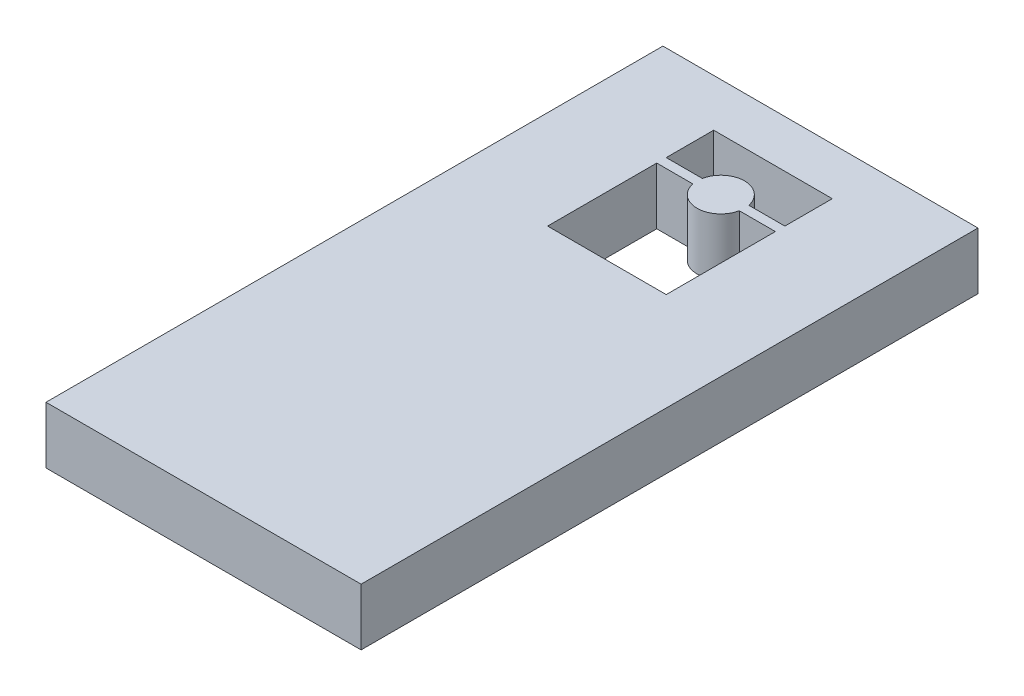
ISO-10303-21;
HEADER;
FILE_DESCRIPTION(('STEP AP214'),'2;1');
FILE_NAME('part.step','',(''),(''),'','','');
FILE_SCHEMA(('AUTOMOTIVE_DESIGN { 1 0 10303 214 1 1 1 1 }'));
ENDSEC;
DATA;
#1=APPLICATION_CONTEXT('core data for automotive mechanical design processes');
#2=APPLICATION_PROTOCOL_DEFINITION('international standard','automotive_design',2000,#1);
#3=PRODUCT_CONTEXT('',#1,'mechanical');
#4=PRODUCT('Part','Part','',(#3));
#5=PRODUCT_RELATED_PRODUCT_CATEGORY('part','',(#4));
#6=PRODUCT_DEFINITION_FORMATION('','',#4);
#7=PRODUCT_DEFINITION_CONTEXT('part definition',#1,'design');
#8=PRODUCT_DEFINITION('design','',#6,#7);
#9=PRODUCT_DEFINITION_SHAPE('','',#8);
#10=(LENGTH_UNIT() NAMED_UNIT(*) SI_UNIT(.MILLI.,.METRE.));
#11=(NAMED_UNIT(*) PLANE_ANGLE_UNIT() SI_UNIT($,.RADIAN.));
#12=(NAMED_UNIT(*) SI_UNIT($,.STERADIAN.) SOLID_ANGLE_UNIT());
#13=UNCERTAINTY_MEASURE_WITH_UNIT(LENGTH_MEASURE(1.E-05),#10,'distance_accuracy_value','');
#14=(GEOMETRIC_REPRESENTATION_CONTEXT(3) GLOBAL_UNCERTAINTY_ASSIGNED_CONTEXT((#13)) GLOBAL_UNIT_ASSIGNED_CONTEXT((#10,
#11,#12)) REPRESENTATION_CONTEXT('',''));
#15=CARTESIAN_POINT('',(0.,0.,0.));
#16=DIRECTION('',(0.,0.,1.));
#17=DIRECTION('',(1.,0.,0.));
#18=AXIS2_PLACEMENT_3D('',#15,#16,#17);
#19=CARTESIAN_POINT('',(20.7,0.,-110.));
#20=DIRECTION('',(0.,0.,-1.));
#21=DIRECTION('',(-1.,0.,0.));
#22=AXIS2_PLACEMENT_3D('',#19,#20,#21);
#23=PLANE('',#22);
#24=DIRECTION('',(0.,1.,0.));
#25=VECTOR('',#24,1.);
#26=CARTESIAN_POINT('',(28.3010205144337,0.,-110.));
#27=LINE('',#26,#25);
#28=CARTESIAN_POINT('',(28.3010205144337,0.,-110.));
#29=VERTEX_POINT('',#28);
#30=CARTESIAN_POINT('',(28.3010205144337,12.,-110.));
#31=VERTEX_POINT('',#30);
#32=EDGE_CURVE('E152',#29,#31,#27,.T.);
#33=ORIENTED_EDGE('',*,*,#32,.F.);
#34=DIRECTION('',(-1.,0.,0.));
#35=VECTOR('',#34,1.);
#36=CARTESIAN_POINT('',(20.7,0.,-110.));
#37=LINE('',#36,#35);
#38=CARTESIAN_POINT('',(20.7,0.,-110.));
#39=VERTEX_POINT('',#38);
#40=EDGE_CURVE('E272',#29,#39,#37,.T.);
#41=ORIENTED_EDGE('',*,*,#40,.T.);
#42=DIRECTION('',(0.,1.,0.));
#43=VECTOR('',#42,1.);
#44=CARTESIAN_POINT('',(20.7,0.,-110.));
#45=LINE('',#44,#43);
#46=CARTESIAN_POINT('',(20.7,12.,-110.));
#47=VERTEX_POINT('',#46);
#48=EDGE_CURVE('E180',#39,#47,#45,.T.);
#49=ORIENTED_EDGE('',*,*,#48,.T.);
#50=DIRECTION('',(-1.,0.,0.));
#51=VECTOR('',#50,1.);
#52=CARTESIAN_POINT('',(20.7,12.,-110.));
#53=LINE('',#52,#51);
#54=EDGE_CURVE('E172',#31,#47,#53,.T.);
#55=ORIENTED_EDGE('',*,*,#54,.F.);
#56=EDGE_LOOP('',(#33,#41,#49,#55));
#57=FACE_BOUND('',#56,.T.);
#58=ADVANCED_FACE('F37',(#57),#23,.T.);
#59=CARTESIAN_POINT('',(20.7,0.,-108.));
#60=DIRECTION('',(0.,0.,1.));
#61=DIRECTION('',(1.,0.,0.));
#62=AXIS2_PLACEMENT_3D('',#59,#60,#61);
#63=PLANE('',#62);
#64=DIRECTION('',(0.,1.,0.));
#65=VECTOR('',#64,1.);
#66=CARTESIAN_POINT('',(38.0989794855664,0.,-108.));
#67=LINE('',#66,#65);
#68=CARTESIAN_POINT('',(38.0989794855664,0.,-108.));
#69=VERTEX_POINT('',#68);
#70=CARTESIAN_POINT('',(38.0989794855664,12.,-108.));
#71=VERTEX_POINT('',#70);
#72=EDGE_CURVE('E11',#69,#71,#67,.T.);
#73=ORIENTED_EDGE('',*,*,#72,.F.);
#74=DIRECTION('',(1.,0.,0.));
#75=VECTOR('',#74,1.);
#76=CARTESIAN_POINT('',(20.7,0.,-108.));
#77=LINE('',#76,#75);
#78=CARTESIAN_POINT('',(45.7,0.,-108.));
#79=VERTEX_POINT('',#78);
#80=EDGE_CURVE('E171',#69,#79,#77,.T.);
#81=ORIENTED_EDGE('',*,*,#80,.T.);
#82=DIRECTION('',(0.,1.,0.));
#83=VECTOR('',#82,1.);
#84=CARTESIAN_POINT('',(45.7,0.,-108.));
#85=LINE('',#84,#83);
#86=CARTESIAN_POINT('',(45.7,12.,-108.));
#87=VERTEX_POINT('',#86);
#88=EDGE_CURVE('E186',#79,#87,#85,.T.);
#89=ORIENTED_EDGE('',*,*,#88,.T.);
#90=DIRECTION('',(1.,0.,0.));
#91=VECTOR('',#90,1.);
#92=CARTESIAN_POINT('',(20.7,12.,-108.));
#93=LINE('',#92,#91);
#94=EDGE_CURVE('E274',#71,#87,#93,.T.);
#95=ORIENTED_EDGE('',*,*,#94,.F.);
#96=EDGE_LOOP('',(#73,#81,#89,#95));
#97=FACE_BOUND('',#96,.T.);
#98=ADVANCED_FACE('F289',(#97),#63,.T.);
#99=CARTESIAN_POINT('',(20.7,-8.,-130.));
#100=DIRECTION('',(-1.,0.,0.));
#101=DIRECTION('',(0.,0.,1.));
#102=AXIS2_PLACEMENT_3D('',#99,#100,#101);
#103=PLANE('',#102);
#104=DIRECTION('',(0.,0.,1.));
#105=VECTOR('',#104,1.);
#106=CARTESIAN_POINT('',(20.7,12.,-130.));
#107=LINE('',#106,#105);
#108=CARTESIAN_POINT('',(20.7,12.,-120.));
#109=VERTEX_POINT('',#108);
#110=EDGE_CURVE('E203',#109,#47,#107,.T.);
#111=ORIENTED_EDGE('',*,*,#110,.T.);
#112=ORIENTED_EDGE('',*,*,#48,.F.);
#113=DIRECTION('',(0.,0.,-1.));
#114=VECTOR('',#113,1.);
#115=CARTESIAN_POINT('',(20.7,0.,0.));
#116=LINE('',#115,#114);
#117=CARTESIAN_POINT('',(20.7,0.,-120.));
#118=VERTEX_POINT('',#117);
#119=EDGE_CURVE('E252',#39,#118,#116,.T.);
#120=ORIENTED_EDGE('',*,*,#119,.T.);
#121=DIRECTION('',(0.,1.,0.));
#122=VECTOR('',#121,1.);
#123=CARTESIAN_POINT('',(20.7,0.,-120.));
#124=LINE('',#123,#122);
#125=EDGE_CURVE('E195',#118,#109,#124,.T.);
#126=ORIENTED_EDGE('',*,*,#125,.T.);
#127=EDGE_LOOP('',(#111,#112,#120,#126));
#128=FACE_BOUND('',#127,.T.);
#129=ADVANCED_FACE('F291',(#128),#103,.F.);
#130=CARTESIAN_POINT('',(45.7,-8.,-130.));
#131=DIRECTION('',(1.,0.,0.));
#132=DIRECTION('',(0.,0.,-1.));
#133=AXIS2_PLACEMENT_3D('',#130,#131,#132);
#134=PLANE('',#133);
#135=DIRECTION('',(0.,0.,1.));
#136=VECTOR('',#135,1.);
#137=CARTESIAN_POINT('',(45.7,0.,0.));
#138=LINE('',#137,#136);
#139=CARTESIAN_POINT('',(45.7,0.,-120.));
#140=VERTEX_POINT('',#139);
#141=CARTESIAN_POINT('',(45.7,0.,-110.));
#142=VERTEX_POINT('',#141);
#143=EDGE_CURVE('E250',#140,#142,#138,.T.);
#144=ORIENTED_EDGE('',*,*,#143,.T.);
#145=DIRECTION('',(0.,1.,0.));
#146=VECTOR('',#145,1.);
#147=CARTESIAN_POINT('',(45.7,0.,-110.));
#148=LINE('',#147,#146);
#149=CARTESIAN_POINT('',(45.7,12.,-110.));
#150=VERTEX_POINT('',#149);
#151=EDGE_CURVE('E184',#142,#150,#148,.T.);
#152=ORIENTED_EDGE('',*,*,#151,.T.);
#153=DIRECTION('',(0.,0.,-1.));
#154=VECTOR('',#153,1.);
#155=CARTESIAN_POINT('',(45.7,12.,-130.));
#156=LINE('',#155,#154);
#157=CARTESIAN_POINT('',(45.7,12.,-120.));
#158=VERTEX_POINT('',#157);
#159=EDGE_CURVE('E169',#150,#158,#156,.T.);
#160=ORIENTED_EDGE('',*,*,#159,.T.);
#161=DIRECTION('',(0.,1.,0.));
#162=VECTOR('',#161,1.);
#163=CARTESIAN_POINT('',(45.7,0.,-120.));
#164=LINE('',#163,#162);
#165=EDGE_CURVE('E197',#140,#158,#164,.T.);
#166=ORIENTED_EDGE('',*,*,#165,.F.);
#167=EDGE_LOOP('',(#144,#152,#160,#166));
#168=FACE_BOUND('',#167,.T.);
#169=ADVANCED_FACE('F298',(#168),#134,.F.);
#170=CARTESIAN_POINT('',(0.,12.,0.));
#171=DIRECTION('',(1.,0.,0.));
#172=DIRECTION('',(0.,0.,-1.));
#173=AXIS2_PLACEMENT_3D('',#170,#171,#172);
#174=PLANE('',#173);
#175=DIRECTION('',(0.,0.,1.));
#176=VECTOR('',#175,1.);
#177=CARTESIAN_POINT('',(0.,0.,0.));
#178=LINE('',#177,#176);
#179=CARTESIAN_POINT('',(0.,0.,-130.));
#180=VERTEX_POINT('',#179);
#181=CARTESIAN_POINT('',(0.,0.,0.));
#182=VERTEX_POINT('',#181);
#183=EDGE_CURVE('E215',#180,#182,#178,.T.);
#184=ORIENTED_EDGE('',*,*,#183,.T.);
#185=DIRECTION('',(0.,-1.,0.));
#186=VECTOR('',#185,1.);
#187=CARTESIAN_POINT('',(0.,12.,0.));
#188=LINE('',#187,#186);
#189=CARTESIAN_POINT('',(0.,12.,0.));
#190=VERTEX_POINT('',#189);
#191=EDGE_CURVE('E244',#190,#182,#188,.T.);
#192=ORIENTED_EDGE('',*,*,#191,.F.);
#193=DIRECTION('',(0.,0.,1.));
#194=VECTOR('',#193,1.);
#195=CARTESIAN_POINT('',(0.,12.,0.));
#196=LINE('',#195,#194);
#197=CARTESIAN_POINT('',(0.,12.,-130.));
#198=VERTEX_POINT('',#197);
#199=EDGE_CURVE('E218',#198,#190,#196,.T.);
#200=ORIENTED_EDGE('',*,*,#199,.F.);
#201=DIRECTION('',(0.,-1.,0.));
#202=VECTOR('',#201,1.);
#203=CARTESIAN_POINT('',(0.,12.,-130.));
#204=LINE('',#203,#202);
#205=EDGE_CURVE('E228',#198,#180,#204,.T.);
#206=ORIENTED_EDGE('',*,*,#205,.T.);
#207=EDGE_LOOP('',(#184,#192,#200,#206));
#208=FACE_BOUND('',#207,.T.);
#209=ADVANCED_FACE('F39',(#208),#174,.F.);
#210=CARTESIAN_POINT('',(0.,12.,0.));
#211=DIRECTION('',(0.,0.,-1.));
#212=DIRECTION('',(-1.,0.,0.));
#213=AXIS2_PLACEMENT_3D('',#210,#211,#212);
#214=PLANE('',#213);
#215=DIRECTION('',(1.,0.,0.));
#216=VECTOR('',#215,1.);
#217=CARTESIAN_POINT('',(0.,0.,0.));
#218=LINE('',#217,#216);
#219=CARTESIAN_POINT('',(66.4,0.,0.));
#220=VERTEX_POINT('',#219);
#221=EDGE_CURVE('E231',#182,#220,#218,.T.);
#222=ORIENTED_EDGE('',*,*,#221,.T.);
#223=DIRECTION('',(0.,-1.,0.));
#224=VECTOR('',#223,1.);
#225=CARTESIAN_POINT('',(66.4,12.,0.));
#226=LINE('',#225,#224);
#227=CARTESIAN_POINT('',(66.4,12.,0.));
#228=VERTEX_POINT('',#227);
#229=EDGE_CURVE('E241',#228,#220,#226,.T.);
#230=ORIENTED_EDGE('',*,*,#229,.F.);
#231=DIRECTION('',(1.,0.,0.));
#232=VECTOR('',#231,1.);
#233=CARTESIAN_POINT('',(0.,12.,0.));
#234=LINE('',#233,#232);
#235=EDGE_CURVE('E221',#190,#228,#234,.T.);
#236=ORIENTED_EDGE('',*,*,#235,.F.);
#237=ORIENTED_EDGE('',*,*,#191,.T.);
#238=EDGE_LOOP('',(#222,#230,#236,#237));
#239=FACE_BOUND('',#238,.T.);
#240=ADVANCED_FACE('F333',(#239),#214,.F.);
#241=CARTESIAN_POINT('',(66.4,12.,0.));
#242=DIRECTION('',(-1.,0.,0.));
#243=DIRECTION('',(0.,0.,1.));
#244=AXIS2_PLACEMENT_3D('',#241,#242,#243);
#245=PLANE('',#244);
#246=DIRECTION('',(0.,0.,-1.));
#247=VECTOR('',#246,1.);
#248=CARTESIAN_POINT('',(66.4,0.,0.));
#249=LINE('',#248,#247);
#250=CARTESIAN_POINT('',(66.4,0.,-130.));
#251=VERTEX_POINT('',#250);
#252=EDGE_CURVE('E233',#220,#251,#249,.T.);
#253=ORIENTED_EDGE('',*,*,#252,.T.);
#254=DIRECTION('',(0.,-1.,0.));
#255=VECTOR('',#254,1.);
#256=CARTESIAN_POINT('',(66.4,12.,-130.));
#257=LINE('',#256,#255);
#258=CARTESIAN_POINT('',(66.4,12.,-130.));
#259=VERTEX_POINT('',#258);
#260=EDGE_CURVE('E238',#259,#251,#257,.T.);
#261=ORIENTED_EDGE('',*,*,#260,.F.);
#262=DIRECTION('',(0.,0.,-1.));
#263=VECTOR('',#262,1.);
#264=CARTESIAN_POINT('',(66.4,12.,0.));
#265=LINE('',#264,#263);
#266=EDGE_CURVE('E224',#228,#259,#265,.T.);
#267=ORIENTED_EDGE('',*,*,#266,.F.);
#268=ORIENTED_EDGE('',*,*,#229,.T.);
#269=EDGE_LOOP('',(#253,#261,#267,#268));
#270=FACE_BOUND('',#269,.T.);
#271=ADVANCED_FACE('F330',(#270),#245,.F.);
#272=CARTESIAN_POINT('',(0.,12.,-130.));
#273=DIRECTION('',(0.,0.,1.));
#274=DIRECTION('',(1.,0.,0.));
#275=AXIS2_PLACEMENT_3D('',#272,#273,#274);
#276=PLANE('',#275);
#277=DIRECTION('',(-1.,0.,0.));
#278=VECTOR('',#277,1.);
#279=CARTESIAN_POINT('',(0.,0.,-130.));
#280=LINE('',#279,#278);
#281=EDGE_CURVE('E222',#251,#180,#280,.T.);
#282=ORIENTED_EDGE('',*,*,#281,.T.);
#283=ORIENTED_EDGE('',*,*,#205,.F.);
#284=DIRECTION('',(-1.,0.,0.));
#285=VECTOR('',#284,1.);
#286=CARTESIAN_POINT('',(0.,12.,-130.));
#287=LINE('',#286,#285);
#288=EDGE_CURVE('E226',#259,#198,#287,.T.);
#289=ORIENTED_EDGE('',*,*,#288,.F.);
#290=ORIENTED_EDGE('',*,*,#260,.T.);
#291=EDGE_LOOP('',(#282,#283,#289,#290));
#292=FACE_BOUND('',#291,.T.);
#293=ADVANCED_FACE('F327',(#292),#276,.F.);
#294=CARTESIAN_POINT('',(0.,12.,0.));
#295=DIRECTION('',(0.,-1.,0.));
#296=DIRECTION('',(0.,0.,-1.));
#297=AXIS2_PLACEMENT_3D('',#294,#295,#296);
#298=PLANE('',#297);
#299=CARTESIAN_POINT('',(33.2,12.,-109.));
#300=DIRECTION('',(0.,1.,0.));
#301=DIRECTION('',(0.,0.,1.));
#302=AXIS2_PLACEMENT_3D('',#299,#300,#301);
#303=CIRCLE('',#302,5.);
#304=CARTESIAN_POINT('',(28.3010205144337,12.,-108.));
#305=VERTEX_POINT('',#304);
#306=EDGE_CURVE('E60',#305,#71,#303,.T.);
#307=ORIENTED_EDGE('',*,*,#306,.T.);
#308=ORIENTED_EDGE('',*,*,#94,.T.);
#309=CARTESIAN_POINT('',(45.7,12.,-85.));
#310=VERTEX_POINT('',#309);
#311=EDGE_CURVE('E209',#310,#87,#156,.T.);
#312=ORIENTED_EDGE('',*,*,#311,.F.);
#313=DIRECTION('',(1.,0.,0.));
#314=VECTOR('',#313,1.);
#315=CARTESIAN_POINT('',(20.7,12.,-85.));
#316=LINE('',#315,#314);
#317=CARTESIAN_POINT('',(20.7,12.,-85.));
#318=VERTEX_POINT('',#317);
#319=EDGE_CURVE('E206',#318,#310,#316,.T.);
#320=ORIENTED_EDGE('',*,*,#319,.F.);
#321=CARTESIAN_POINT('',(20.7,12.,-108.));
#322=VERTEX_POINT('',#321);
#323=EDGE_CURVE('E200',#322,#318,#107,.T.);
#324=ORIENTED_EDGE('',*,*,#323,.F.);
#325=EDGE_CURVE('E176',#322,#305,#93,.T.);
#326=ORIENTED_EDGE('',*,*,#325,.T.);
#327=EDGE_LOOP('',(#307,#308,#312,#320,#324,#326));
#328=FACE_BOUND('',#327,.T.);
#329=CARTESIAN_POINT('',(38.0989794855664,12.,-110.));
#330=VERTEX_POINT('',#329);
#331=EDGE_CURVE('E161',#150,#330,#53,.T.);
#332=ORIENTED_EDGE('',*,*,#331,.T.);
#333=EDGE_CURVE('E52',#330,#31,#303,.T.);
#334=ORIENTED_EDGE('',*,*,#333,.T.);
#335=ORIENTED_EDGE('',*,*,#54,.T.);
#336=ORIENTED_EDGE('',*,*,#110,.F.);
#337=DIRECTION('',(1.,0.,0.));
#338=VECTOR('',#337,1.);
#339=CARTESIAN_POINT('',(20.7,12.,-120.));
#340=LINE('',#339,#338);
#341=EDGE_CURVE('E183',#109,#158,#340,.T.);
#342=ORIENTED_EDGE('',*,*,#341,.T.);
#343=ORIENTED_EDGE('',*,*,#159,.F.);
#344=EDGE_LOOP('',(#332,#334,#335,#336,#342,#343));
#345=FACE_BOUND('',#344,.T.);
#346=ORIENTED_EDGE('',*,*,#288,.T.);
#347=ORIENTED_EDGE('',*,*,#199,.T.);
#348=ORIENTED_EDGE('',*,*,#235,.T.);
#349=ORIENTED_EDGE('',*,*,#266,.T.);
#350=EDGE_LOOP('',(#346,#347,#348,#349));
#351=FACE_BOUND('',#350,.T.);
#352=ADVANCED_FACE('F166',(#328,#345,#351),#298,.F.);
#353=CARTESIAN_POINT('',(0.,0.,0.));
#354=DIRECTION('',(0.,-1.,0.));
#355=DIRECTION('',(0.,0.,-1.));
#356=AXIS2_PLACEMENT_3D('',#353,#354,#355);
#357=PLANE('',#356);
#358=ORIENTED_EDGE('',*,*,#80,.F.);
#359=CARTESIAN_POINT('',(33.2,0.,-109.));
#360=DIRECTION('',(0.,1.,0.));
#361=DIRECTION('',(0.,0.,1.));
#362=AXIS2_PLACEMENT_3D('',#359,#360,#361);
#363=CIRCLE('',#362,5.);
#364=CARTESIAN_POINT('',(28.3010205144337,0.,-108.));
#365=VERTEX_POINT('',#364);
#366=EDGE_CURVE('E154',#365,#69,#363,.T.);
#367=ORIENTED_EDGE('',*,*,#366,.F.);
#368=CARTESIAN_POINT('',(20.7,0.,-108.));
#369=VERTEX_POINT('',#368);
#370=EDGE_CURVE('E174',#369,#365,#77,.T.);
#371=ORIENTED_EDGE('',*,*,#370,.F.);
#372=CARTESIAN_POINT('',(20.7,0.,-85.));
#373=VERTEX_POINT('',#372);
#374=EDGE_CURVE('E253',#373,#369,#116,.T.);
#375=ORIENTED_EDGE('',*,*,#374,.F.);
#376=DIRECTION('',(-1.,0.,0.));
#377=VECTOR('',#376,1.);
#378=CARTESIAN_POINT('',(0.,0.,-85.));
#379=LINE('',#378,#377);
#380=CARTESIAN_POINT('',(45.7,0.,-85.));
#381=VERTEX_POINT('',#380);
#382=EDGE_CURVE('E247',#381,#373,#379,.T.);
#383=ORIENTED_EDGE('',*,*,#382,.F.);
#384=EDGE_CURVE('E249',#79,#381,#138,.T.);
#385=ORIENTED_EDGE('',*,*,#384,.F.);
#386=EDGE_LOOP('',(#358,#367,#371,#375,#383,#385));
#387=FACE_BOUND('',#386,.T.);
#388=CARTESIAN_POINT('',(38.0989794855664,0.,-110.));
#389=VERTEX_POINT('',#388);
#390=EDGE_CURVE('E164',#389,#29,#363,.T.);
#391=ORIENTED_EDGE('',*,*,#390,.F.);
#392=EDGE_CURVE('E163',#142,#389,#37,.T.);
#393=ORIENTED_EDGE('',*,*,#392,.F.);
#394=ORIENTED_EDGE('',*,*,#143,.F.);
#395=DIRECTION('',(1.,0.,0.));
#396=VECTOR('',#395,1.);
#397=CARTESIAN_POINT('',(20.7,0.,-120.));
#398=LINE('',#397,#396);
#399=EDGE_CURVE('E192',#118,#140,#398,.T.);
#400=ORIENTED_EDGE('',*,*,#399,.F.);
#401=ORIENTED_EDGE('',*,*,#119,.F.);
#402=ORIENTED_EDGE('',*,*,#40,.F.);
#403=EDGE_LOOP('',(#391,#393,#394,#400,#401,#402));
#404=FACE_BOUND('',#403,.T.);
#405=ORIENTED_EDGE('',*,*,#183,.F.);
#406=ORIENTED_EDGE('',*,*,#281,.F.);
#407=ORIENTED_EDGE('',*,*,#252,.F.);
#408=ORIENTED_EDGE('',*,*,#221,.F.);
#409=EDGE_LOOP('',(#405,#406,#407,#408));
#410=FACE_BOUND('',#409,.T.);
#411=ADVANCED_FACE('F265',(#387,#404,#410),#357,.T.);
#412=ORIENTED_EDGE('',*,*,#374,.T.);
#413=DIRECTION('',(0.,1.,0.));
#414=VECTOR('',#413,1.);
#415=CARTESIAN_POINT('',(20.7,0.,-108.));
#416=LINE('',#415,#414);
#417=EDGE_CURVE('E189',#369,#322,#416,.T.);
#418=ORIENTED_EDGE('',*,*,#417,.T.);
#419=ORIENTED_EDGE('',*,*,#323,.T.);
#420=DIRECTION('',(0.,1.,0.));
#421=VECTOR('',#420,1.);
#422=CARTESIAN_POINT('',(20.7,-8.,-85.));
#423=LINE('',#422,#421);
#424=EDGE_CURVE('E212',#373,#318,#423,.T.);
#425=ORIENTED_EDGE('',*,*,#424,.F.);
#426=EDGE_LOOP('',(#412,#418,#419,#425));
#427=FACE_BOUND('',#426,.T.);
#428=ADVANCED_FACE('F280',(#427),#103,.F.);
#429=ORIENTED_EDGE('',*,*,#311,.T.);
#430=ORIENTED_EDGE('',*,*,#88,.F.);
#431=ORIENTED_EDGE('',*,*,#384,.T.);
#432=DIRECTION('',(0.,1.,0.));
#433=VECTOR('',#432,1.);
#434=CARTESIAN_POINT('',(45.7,-8.,-85.));
#435=LINE('',#434,#433);
#436=EDGE_CURVE('E213',#381,#310,#435,.T.);
#437=ORIENTED_EDGE('',*,*,#436,.T.);
#438=EDGE_LOOP('',(#429,#430,#431,#437));
#439=FACE_BOUND('',#438,.T.);
#440=ADVANCED_FACE('F286',(#439),#134,.F.);
#441=CARTESIAN_POINT('',(20.7,-8.,-85.));
#442=DIRECTION('',(0.,0.,1.));
#443=DIRECTION('',(1.,0.,0.));
#444=AXIS2_PLACEMENT_3D('',#441,#442,#443);
#445=PLANE('',#444);
#446=ORIENTED_EDGE('',*,*,#382,.T.);
#447=ORIENTED_EDGE('',*,*,#424,.T.);
#448=ORIENTED_EDGE('',*,*,#319,.T.);
#449=ORIENTED_EDGE('',*,*,#436,.F.);
#450=EDGE_LOOP('',(#446,#447,#448,#449));
#451=FACE_BOUND('',#450,.T.);
#452=ADVANCED_FACE('F284',(#451),#445,.F.);
#453=CARTESIAN_POINT('',(20.7,0.,-120.));
#454=DIRECTION('',(0.,0.,1.));
#455=DIRECTION('',(1.,0.,0.));
#456=AXIS2_PLACEMENT_3D('',#453,#454,#455);
#457=PLANE('',#456);
#458=ORIENTED_EDGE('',*,*,#341,.F.);
#459=ORIENTED_EDGE('',*,*,#125,.F.);
#460=ORIENTED_EDGE('',*,*,#399,.T.);
#461=ORIENTED_EDGE('',*,*,#165,.T.);
#462=EDGE_LOOP('',(#458,#459,#460,#461));
#463=FACE_BOUND('',#462,.T.);
#464=ADVANCED_FACE('F310',(#463),#457,.T.);
#465=DIRECTION('',(0.,1.,0.));
#466=VECTOR('',#465,1.);
#467=CARTESIAN_POINT('',(38.0989794855664,0.,-110.));
#468=LINE('',#467,#466);
#469=EDGE_CURVE('E149',#330,#389,#468,.F.);
#470=ORIENTED_EDGE('',*,*,#469,.F.);
#471=ORIENTED_EDGE('',*,*,#331,.F.);
#472=ORIENTED_EDGE('',*,*,#151,.F.);
#473=ORIENTED_EDGE('',*,*,#392,.T.);
#474=EDGE_LOOP('',(#470,#471,#472,#473));
#475=FACE_BOUND('',#474,.T.);
#476=ADVANCED_FACE('F159',(#475),#23,.T.);
#477=DIRECTION('',(0.,1.,0.));
#478=VECTOR('',#477,1.);
#479=CARTESIAN_POINT('',(28.3010205144337,0.,-108.));
#480=LINE('',#479,#478);
#481=EDGE_CURVE('E45',#305,#365,#480,.F.);
#482=ORIENTED_EDGE('',*,*,#481,.F.);
#483=ORIENTED_EDGE('',*,*,#325,.F.);
#484=ORIENTED_EDGE('',*,*,#417,.F.);
#485=ORIENTED_EDGE('',*,*,#370,.T.);
#486=EDGE_LOOP('',(#482,#483,#484,#485));
#487=FACE_BOUND('',#486,.T.);
#488=ADVANCED_FACE('F271',(#487),#63,.T.);
#489=CARTESIAN_POINT('',(33.2,0.,-109.));
#490=DIRECTION('',(0.,1.,0.));
#491=DIRECTION('',(0.,0.,1.));
#492=AXIS2_PLACEMENT_3D('',#489,#490,#491);
#493=CYLINDRICAL_SURFACE('',#492,5.);
#494=ORIENTED_EDGE('',*,*,#366,.T.);
#495=ORIENTED_EDGE('',*,*,#72,.T.);
#496=ORIENTED_EDGE('',*,*,#306,.F.);
#497=ORIENTED_EDGE('',*,*,#481,.T.);
#498=EDGE_LOOP('',(#494,#495,#496,#497));
#499=FACE_BOUND('',#498,.T.);
#500=ADVANCED_FACE('F257',(#499),#493,.T.);
#501=ORIENTED_EDGE('',*,*,#390,.T.);
#502=ORIENTED_EDGE('',*,*,#32,.T.);
#503=ORIENTED_EDGE('',*,*,#333,.F.);
#504=ORIENTED_EDGE('',*,*,#469,.T.);
#505=EDGE_LOOP('',(#501,#502,#503,#504));
#506=FACE_BOUND('',#505,.T.);
#507=ADVANCED_FACE('F148',(#506),#493,.T.);
#508=CLOSED_SHELL('',(#58,#98,#129,#169,#209,#240,#271,#293,#352,#411,#428,#440,#452,#464,#476,
#488,#500,#507));
#509=MANIFOLD_SOLID_BREP('B2',#508);
#510=ADVANCED_BREP_SHAPE_REPRESENTATION('',(#18,#509),#14);
#511=SHAPE_DEFINITION_REPRESENTATION(#9,#510);
ENDSEC;
END-ISO-10303-21;
